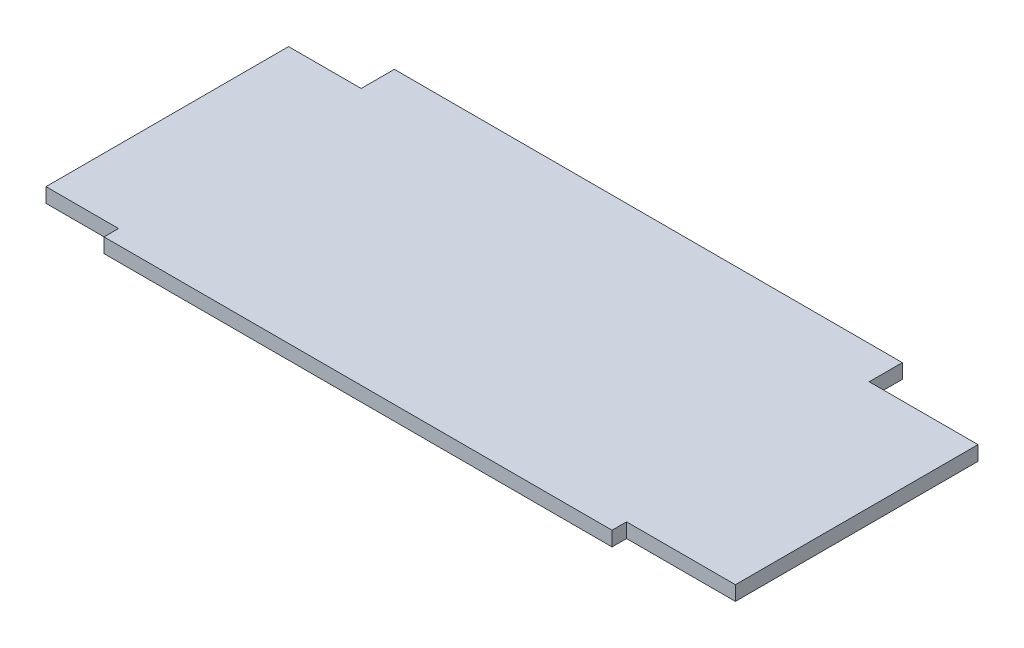
ISO-10303-21;
HEADER;
FILE_DESCRIPTION(('STEP AP214'),'2;1');
FILE_NAME('part.step','',(''),(''),'','','');
FILE_SCHEMA(('AUTOMOTIVE_DESIGN { 1 0 10303 214 1 1 1 1 }'));
ENDSEC;
DATA;
#1=APPLICATION_CONTEXT('core data for automotive mechanical design processes');
#2=APPLICATION_PROTOCOL_DEFINITION('international standard','automotive_design',2000,#1);
#3=PRODUCT_CONTEXT('',#1,'mechanical');
#4=PRODUCT('Part','Part','',(#3));
#5=PRODUCT_RELATED_PRODUCT_CATEGORY('part','',(#4));
#6=PRODUCT_DEFINITION_FORMATION('','',#4);
#7=PRODUCT_DEFINITION_CONTEXT('part definition',#1,'design');
#8=PRODUCT_DEFINITION('design','',#6,#7);
#9=PRODUCT_DEFINITION_SHAPE('','',#8);
#10=(LENGTH_UNIT() NAMED_UNIT(*) SI_UNIT(.MILLI.,.METRE.));
#11=(NAMED_UNIT(*) PLANE_ANGLE_UNIT() SI_UNIT($,.RADIAN.));
#12=(NAMED_UNIT(*) SI_UNIT($,.STERADIAN.) SOLID_ANGLE_UNIT());
#13=UNCERTAINTY_MEASURE_WITH_UNIT(LENGTH_MEASURE(1.E-05),#10,'distance_accuracy_value','');
#14=(GEOMETRIC_REPRESENTATION_CONTEXT(3) GLOBAL_UNCERTAINTY_ASSIGNED_CONTEXT((#13)) GLOBAL_UNIT_ASSIGNED_CONTEXT((#10,
#11,#12)) REPRESENTATION_CONTEXT('',''));
#15=CARTESIAN_POINT('',(0.,0.,0.));
#16=DIRECTION('',(0.,0.,1.));
#17=DIRECTION('',(1.,0.,0.));
#18=AXIS2_PLACEMENT_3D('',#15,#16,#17);
#19=CARTESIAN_POINT('',(78.,-72.5,105.456445940041));
#20=DIRECTION('',(1.,0.,0.));
#21=DIRECTION('',(0.,0.,-1.));
#22=AXIS2_PLACEMENT_3D('',#19,#20,#21);
#23=PLANE('',#22);
#24=DIRECTION('',(0.,-1.,0.));
#25=VECTOR('',#24,1.);
#26=CARTESIAN_POINT('',(78.,-72.5,0.));
#27=LINE('',#26,#25);
#28=CARTESIAN_POINT('',(78.,-72.5,0.));
#29=VERTEX_POINT('',#28);
#30=CARTESIAN_POINT('',(78.,-74.5,0.));
#31=VERTEX_POINT('',#30);
#32=EDGE_CURVE('E146',#29,#31,#27,.T.);
#33=ORIENTED_EDGE('',*,*,#32,.F.);
#34=DIRECTION('',(0.,0.,-1.));
#35=VECTOR('',#34,1.);
#36=CARTESIAN_POINT('',(78.,-72.5,105.456445940041));
#37=LINE('',#36,#35);
#38=CARTESIAN_POINT('',(78.,-72.5,-4.57211966000516));
#39=VERTEX_POINT('',#38);
#40=EDGE_CURVE('E185',#29,#39,#37,.T.);
#41=ORIENTED_EDGE('',*,*,#40,.T.);
#42=DIRECTION('',(0.,1.,0.));
#43=VECTOR('',#42,1.);
#44=CARTESIAN_POINT('',(78.,-72.5,-4.57211966000516));
#45=LINE('',#44,#43);
#46=CARTESIAN_POINT('',(78.,-74.5,-4.57211966000516));
#47=VERTEX_POINT('',#46);
#48=EDGE_CURVE('E194',#47,#39,#45,.T.);
#49=ORIENTED_EDGE('',*,*,#48,.F.);
#50=DIRECTION('',(0.,0.,-1.));
#51=VECTOR('',#50,1.);
#52=CARTESIAN_POINT('',(78.,-74.5,105.456445940041));
#53=LINE('',#52,#51);
#54=EDGE_CURVE('E50',#31,#47,#53,.T.);
#55=ORIENTED_EDGE('',*,*,#54,.F.);
#56=EDGE_LOOP('',(#33,#41,#49,#55));
#57=FACE_BOUND('',#56,.T.);
#58=ADVANCED_FACE('F33',(#57),#23,.F.);
#59=DIRECTION('',(0.,1.,0.));
#60=VECTOR('',#59,1.);
#61=CARTESIAN_POINT('',(78.,-72.5,33.4278803399949));
#62=LINE('',#61,#60);
#63=CARTESIAN_POINT('',(78.,-74.5,33.4278803399949));
#64=VERTEX_POINT('',#63);
#65=CARTESIAN_POINT('',(78.,-72.5,33.4278803399949));
#66=VERTEX_POINT('',#65);
#67=EDGE_CURVE('E58',#64,#66,#62,.T.);
#68=ORIENTED_EDGE('',*,*,#67,.F.);
#69=CARTESIAN_POINT('',(78.,-74.5,35.4278803399948));
#70=VERTEX_POINT('',#69);
#71=EDGE_CURVE('E198',#70,#64,#53,.T.);
#72=ORIENTED_EDGE('',*,*,#71,.F.);
#73=DIRECTION('',(0.,-1.,0.));
#74=VECTOR('',#73,1.);
#75=CARTESIAN_POINT('',(78.,-72.5,35.4278803399948));
#76=LINE('',#75,#74);
#77=CARTESIAN_POINT('',(78.,-72.5,35.4278803399948));
#78=VERTEX_POINT('',#77);
#79=EDGE_CURVE('E218',#78,#70,#76,.T.);
#80=ORIENTED_EDGE('',*,*,#79,.F.);
#81=EDGE_CURVE('E189',#78,#66,#37,.T.);
#82=ORIENTED_EDGE('',*,*,#81,.T.);
#83=EDGE_LOOP('',(#68,#72,#80,#82));
#84=FACE_BOUND('',#83,.T.);
#85=ADVANCED_FACE('F282',(#84),#23,.F.);
#86=CARTESIAN_POINT('',(148.,-72.5,105.456445940041));
#87=DIRECTION('',(-1.,0.,0.));
#88=DIRECTION('',(0.,0.,1.));
#89=AXIS2_PLACEMENT_3D('',#86,#87,#88);
#90=PLANE('',#89);
#91=DIRECTION('',(0.,1.,0.));
#92=VECTOR('',#91,1.);
#93=CARTESIAN_POINT('',(148.,-72.5,0.));
#94=LINE('',#93,#92);
#95=CARTESIAN_POINT('',(148.,-74.5,0.));
#96=VERTEX_POINT('',#95);
#97=CARTESIAN_POINT('',(148.,-72.5,0.));
#98=VERTEX_POINT('',#97);
#99=EDGE_CURVE('E147',#96,#98,#94,.T.);
#100=ORIENTED_EDGE('',*,*,#99,.F.);
#101=DIRECTION('',(0.,0.,-1.));
#102=VECTOR('',#101,1.);
#103=CARTESIAN_POINT('',(148.,-74.5,105.456445940041));
#104=LINE('',#103,#102);
#105=CARTESIAN_POINT('',(148.,-74.5,-4.57211966000516));
#106=VERTEX_POINT('',#105);
#107=EDGE_CURVE('E208',#96,#106,#104,.T.);
#108=ORIENTED_EDGE('',*,*,#107,.T.);
#109=DIRECTION('',(0.,-1.,0.));
#110=VECTOR('',#109,1.);
#111=CARTESIAN_POINT('',(148.,-72.5,-4.57211966000516));
#112=LINE('',#111,#110);
#113=CARTESIAN_POINT('',(148.,-72.5,-4.57211966000516));
#114=VERTEX_POINT('',#113);
#115=EDGE_CURVE('E226',#114,#106,#112,.T.);
#116=ORIENTED_EDGE('',*,*,#115,.F.);
#117=DIRECTION('',(0.,0.,-1.));
#118=VECTOR('',#117,1.);
#119=CARTESIAN_POINT('',(148.,-72.5,105.456445940041));
#120=LINE('',#119,#118);
#121=EDGE_CURVE('E207',#98,#114,#120,.T.);
#122=ORIENTED_EDGE('',*,*,#121,.F.);
#123=EDGE_LOOP('',(#100,#108,#116,#122));
#124=FACE_BOUND('',#123,.T.);
#125=ADVANCED_FACE('F286',(#124),#90,.F.);
#126=DIRECTION('',(0.,-1.,0.));
#127=VECTOR('',#126,1.);
#128=CARTESIAN_POINT('',(148.,-72.5,33.4278803399949));
#129=LINE('',#128,#127);
#130=CARTESIAN_POINT('',(148.,-72.5,33.4278803399949));
#131=VERTEX_POINT('',#130);
#132=CARTESIAN_POINT('',(148.,-74.5,33.4278803399949));
#133=VERTEX_POINT('',#132);
#134=EDGE_CURVE('E150',#131,#133,#129,.T.);
#135=ORIENTED_EDGE('',*,*,#134,.F.);
#136=CARTESIAN_POINT('',(148.,-72.5,35.4278803399948));
#137=VERTEX_POINT('',#136);
#138=EDGE_CURVE('E219',#137,#131,#120,.T.);
#139=ORIENTED_EDGE('',*,*,#138,.F.);
#140=DIRECTION('',(0.,1.,0.));
#141=VECTOR('',#140,1.);
#142=CARTESIAN_POINT('',(148.,-72.5,35.4278803399948));
#143=LINE('',#142,#141);
#144=CARTESIAN_POINT('',(148.,-74.5,35.4278803399948));
#145=VERTEX_POINT('',#144);
#146=EDGE_CURVE('E11',#145,#137,#143,.T.);
#147=ORIENTED_EDGE('',*,*,#146,.F.);
#148=EDGE_CURVE('E204',#145,#133,#104,.T.);
#149=ORIENTED_EDGE('',*,*,#148,.T.);
#150=EDGE_LOOP('',(#135,#139,#147,#149));
#151=FACE_BOUND('',#150,.T.);
#152=ADVANCED_FACE('F290',(#151),#90,.F.);
#153=CARTESIAN_POINT('',(78.,-74.5,105.456445940041));
#154=DIRECTION('',(0.,1.,0.));
#155=DIRECTION('',(0.,0.,1.));
#156=AXIS2_PLACEMENT_3D('',#153,#154,#155);
#157=PLANE('',#156);
#158=DIRECTION('',(1.,0.,0.));
#159=VECTOR('',#158,1.);
#160=CARTESIAN_POINT('',(78.,-74.5,35.4278803399948));
#161=LINE('',#160,#159);
#162=EDGE_CURVE('E42',#70,#145,#161,.T.);
#163=ORIENTED_EDGE('',*,*,#162,.F.);
#164=ORIENTED_EDGE('',*,*,#71,.T.);
#165=DIRECTION('',(1.,0.,0.));
#166=VECTOR('',#165,1.);
#167=CARTESIAN_POINT('',(68.,-74.5,33.4278803399949));
#168=LINE('',#167,#166);
#169=CARTESIAN_POINT('',(68.,-74.5,33.4278803399949));
#170=VERTEX_POINT('',#169);
#171=EDGE_CURVE('E131',#170,#64,#168,.T.);
#172=ORIENTED_EDGE('',*,*,#171,.F.);
#173=DIRECTION('',(0.,0.,1.));
#174=VECTOR('',#173,1.);
#175=CARTESIAN_POINT('',(68.,-74.5,0.));
#176=LINE('',#175,#174);
#177=CARTESIAN_POINT('',(68.,-74.5,0.));
#178=VERTEX_POINT('',#177);
#179=EDGE_CURVE('E124',#178,#170,#176,.T.);
#180=ORIENTED_EDGE('',*,*,#179,.F.);
#181=DIRECTION('',(1.,0.,0.));
#182=VECTOR('',#181,1.);
#183=CARTESIAN_POINT('',(68.,-74.5,0.));
#184=LINE('',#183,#182);
#185=EDGE_CURVE('E128',#178,#31,#184,.T.);
#186=ORIENTED_EDGE('',*,*,#185,.T.);
#187=ORIENTED_EDGE('',*,*,#54,.T.);
#188=DIRECTION('',(-1.,0.,0.));
#189=VECTOR('',#188,1.);
#190=CARTESIAN_POINT('',(78.,-74.5,-4.57211966000516));
#191=LINE('',#190,#189);
#192=EDGE_CURVE('E190',#106,#47,#191,.T.);
#193=ORIENTED_EDGE('',*,*,#192,.F.);
#194=ORIENTED_EDGE('',*,*,#107,.F.);
#195=DIRECTION('',(-1.,0.,0.));
#196=VECTOR('',#195,1.);
#197=CARTESIAN_POINT('',(163.,-74.5,0.));
#198=LINE('',#197,#196);
#199=CARTESIAN_POINT('',(163.,-74.5,0.));
#200=VERTEX_POINT('',#199);
#201=EDGE_CURVE('E242',#200,#96,#198,.T.);
#202=ORIENTED_EDGE('',*,*,#201,.F.);
#203=DIRECTION('',(0.,0.,-1.));
#204=VECTOR('',#203,1.);
#205=CARTESIAN_POINT('',(163.,-74.5,0.));
#206=LINE('',#205,#204);
#207=CARTESIAN_POINT('',(163.,-74.5,33.4278803399949));
#208=VERTEX_POINT('',#207);
#209=EDGE_CURVE('E254',#208,#200,#206,.T.);
#210=ORIENTED_EDGE('',*,*,#209,.F.);
#211=DIRECTION('',(-1.,0.,0.));
#212=VECTOR('',#211,1.);
#213=CARTESIAN_POINT('',(163.,-74.5,33.4278803399949));
#214=LINE('',#213,#212);
#215=EDGE_CURVE('E238',#208,#133,#214,.T.);
#216=ORIENTED_EDGE('',*,*,#215,.T.);
#217=ORIENTED_EDGE('',*,*,#148,.F.);
#218=EDGE_LOOP('',(#163,#164,#172,#180,#186,#187,#193,#194,#202,#210,#216,#217));
#219=FACE_BOUND('',#218,.T.);
#220=ADVANCED_FACE('F126',(#219),#157,.F.);
#221=CARTESIAN_POINT('',(78.,-72.5,105.456445940041));
#222=DIRECTION('',(0.,-1.,0.));
#223=DIRECTION('',(1.,0.,0.));
#224=AXIS2_PLACEMENT_3D('',#221,#222,#223);
#225=PLANE('',#224);
#226=DIRECTION('',(-1.,0.,0.));
#227=VECTOR('',#226,1.);
#228=CARTESIAN_POINT('',(78.,-72.5,35.4278803399948));
#229=LINE('',#228,#227);
#230=EDGE_CURVE('E214',#137,#78,#229,.T.);
#231=ORIENTED_EDGE('',*,*,#230,.F.);
#232=ORIENTED_EDGE('',*,*,#138,.T.);
#233=DIRECTION('',(-1.,0.,0.));
#234=VECTOR('',#233,1.);
#235=CARTESIAN_POINT('',(163.,-72.5,33.4278803399949));
#236=LINE('',#235,#234);
#237=CARTESIAN_POINT('',(163.,-72.5,33.4278803399949));
#238=VERTEX_POINT('',#237);
#239=EDGE_CURVE('E241',#238,#131,#236,.T.);
#240=ORIENTED_EDGE('',*,*,#239,.F.);
#241=DIRECTION('',(0.,0.,1.));
#242=VECTOR('',#241,1.);
#243=CARTESIAN_POINT('',(163.,-72.5,0.));
#244=LINE('',#243,#242);
#245=CARTESIAN_POINT('',(163.,-72.5,0.));
#246=VERTEX_POINT('',#245);
#247=EDGE_CURVE('E263',#246,#238,#244,.T.);
#248=ORIENTED_EDGE('',*,*,#247,.F.);
#249=DIRECTION('',(-1.,0.,0.));
#250=VECTOR('',#249,1.);
#251=CARTESIAN_POINT('',(163.,-72.5,0.));
#252=LINE('',#251,#250);
#253=EDGE_CURVE('E229',#246,#98,#252,.T.);
#254=ORIENTED_EDGE('',*,*,#253,.T.);
#255=ORIENTED_EDGE('',*,*,#121,.T.);
#256=DIRECTION('',(1.,0.,0.));
#257=VECTOR('',#256,1.);
#258=CARTESIAN_POINT('',(78.,-72.5,-4.57211966000516));
#259=LINE('',#258,#257);
#260=EDGE_CURVE('E187',#39,#114,#259,.T.);
#261=ORIENTED_EDGE('',*,*,#260,.F.);
#262=ORIENTED_EDGE('',*,*,#40,.F.);
#263=DIRECTION('',(1.,0.,0.));
#264=VECTOR('',#263,1.);
#265=CARTESIAN_POINT('',(68.,-72.5,0.));
#266=LINE('',#265,#264);
#267=CARTESIAN_POINT('',(68.,-72.5,0.));
#268=VERTEX_POINT('',#267);
#269=EDGE_CURVE('E160',#268,#29,#266,.T.);
#270=ORIENTED_EDGE('',*,*,#269,.F.);
#271=DIRECTION('',(0.,0.,-1.));
#272=VECTOR('',#271,1.);
#273=CARTESIAN_POINT('',(68.,-72.5,0.));
#274=LINE('',#273,#272);
#275=CARTESIAN_POINT('',(68.,-72.5,33.4278803399949));
#276=VERTEX_POINT('',#275);
#277=EDGE_CURVE('E140',#276,#268,#274,.T.);
#278=ORIENTED_EDGE('',*,*,#277,.F.);
#279=DIRECTION('',(1.,0.,0.));
#280=VECTOR('',#279,1.);
#281=CARTESIAN_POINT('',(68.,-72.5,33.4278803399949));
#282=LINE('',#281,#280);
#283=EDGE_CURVE('E152',#276,#66,#282,.T.);
#284=ORIENTED_EDGE('',*,*,#283,.T.);
#285=ORIENTED_EDGE('',*,*,#81,.F.);
#286=EDGE_LOOP('',(#231,#232,#240,#248,#254,#255,#261,#262,#270,#278,#284,#285));
#287=FACE_BOUND('',#286,.T.);
#288=ADVANCED_FACE('F182',(#287),#225,.F.);
#289=CARTESIAN_POINT('',(143.999999999999,3.84978507406153E-12,35.4278803399948));
#290=DIRECTION('',(0.,0.,1.));
#291=DIRECTION('',(-1.,0.,0.));
#292=AXIS2_PLACEMENT_3D('',#289,#290,#291);
#293=PLANE('',#292);
#294=ORIENTED_EDGE('',*,*,#230,.T.);
#295=ORIENTED_EDGE('',*,*,#79,.T.);
#296=ORIENTED_EDGE('',*,*,#162,.T.);
#297=ORIENTED_EDGE('',*,*,#146,.T.);
#298=EDGE_LOOP('',(#294,#295,#296,#297));
#299=FACE_BOUND('',#298,.T.);
#300=ADVANCED_FACE('F35',(#299),#293,.T.);
#301=CARTESIAN_POINT('',(-1.0547118733939E-12,3.85802501057242E-12,-4.57211966000516));
#302=DIRECTION('',(0.,0.,1.));
#303=DIRECTION('',(0.,-1.,0.));
#304=AXIS2_PLACEMENT_3D('',#301,#302,#303);
#305=PLANE('',#304);
#306=ORIENTED_EDGE('',*,*,#48,.T.);
#307=ORIENTED_EDGE('',*,*,#260,.T.);
#308=ORIENTED_EDGE('',*,*,#115,.T.);
#309=ORIENTED_EDGE('',*,*,#192,.T.);
#310=EDGE_LOOP('',(#306,#307,#308,#309));
#311=FACE_BOUND('',#310,.T.);
#312=ADVANCED_FACE('F280',(#311),#305,.F.);
#313=CARTESIAN_POINT('',(163.,-72.5,0.));
#314=DIRECTION('',(0.,0.,1.));
#315=DIRECTION('',(0.,-1.,0.));
#316=AXIS2_PLACEMENT_3D('',#313,#314,#315);
#317=PLANE('',#316);
#318=ORIENTED_EDGE('',*,*,#99,.T.);
#319=ORIENTED_EDGE('',*,*,#253,.F.);
#320=DIRECTION('',(0.,1.,0.));
#321=VECTOR('',#320,1.);
#322=CARTESIAN_POINT('',(163.,-72.5,0.));
#323=LINE('',#322,#321);
#324=EDGE_CURVE('E167',#200,#246,#323,.T.);
#325=ORIENTED_EDGE('',*,*,#324,.F.);
#326=ORIENTED_EDGE('',*,*,#201,.T.);
#327=EDGE_LOOP('',(#318,#319,#325,#326));
#328=FACE_BOUND('',#327,.T.);
#329=ADVANCED_FACE('F268',(#328),#317,.F.);
#330=CARTESIAN_POINT('',(163.,-72.5,33.4278803399949));
#331=DIRECTION('',(0.,0.,-1.));
#332=DIRECTION('',(-1.,0.,0.));
#333=AXIS2_PLACEMENT_3D('',#330,#331,#332);
#334=PLANE('',#333);
#335=ORIENTED_EDGE('',*,*,#134,.T.);
#336=ORIENTED_EDGE('',*,*,#215,.F.);
#337=DIRECTION('',(0.,-1.,0.));
#338=VECTOR('',#337,1.);
#339=CARTESIAN_POINT('',(163.,-72.5,33.4278803399949));
#340=LINE('',#339,#338);
#341=EDGE_CURVE('E259',#238,#208,#340,.T.);
#342=ORIENTED_EDGE('',*,*,#341,.F.);
#343=ORIENTED_EDGE('',*,*,#239,.T.);
#344=EDGE_LOOP('',(#335,#336,#342,#343));
#345=FACE_BOUND('',#344,.T.);
#346=ADVANCED_FACE('F273',(#345),#334,.F.);
#347=CARTESIAN_POINT('',(163.,0.,0.));
#348=DIRECTION('',(-1.,0.,0.));
#349=DIRECTION('',(0.,0.,1.));
#350=AXIS2_PLACEMENT_3D('',#347,#348,#349);
#351=PLANE('',#350);
#352=ORIENTED_EDGE('',*,*,#324,.T.);
#353=ORIENTED_EDGE('',*,*,#247,.T.);
#354=ORIENTED_EDGE('',*,*,#341,.T.);
#355=ORIENTED_EDGE('',*,*,#209,.T.);
#356=EDGE_LOOP('',(#352,#353,#354,#355));
#357=FACE_BOUND('',#356,.T.);
#358=ADVANCED_FACE('F267',(#357),#351,.F.);
#359=CARTESIAN_POINT('',(68.,-72.5,0.));
#360=DIRECTION('',(0.,0.,1.));
#361=DIRECTION('',(0.,-1.,0.));
#362=AXIS2_PLACEMENT_3D('',#359,#360,#361);
#363=PLANE('',#362);
#364=ORIENTED_EDGE('',*,*,#32,.T.);
#365=ORIENTED_EDGE('',*,*,#185,.F.);
#366=DIRECTION('',(0.,-1.,0.));
#367=VECTOR('',#366,1.);
#368=CARTESIAN_POINT('',(68.,-72.5,0.));
#369=LINE('',#368,#367);
#370=EDGE_CURVE('E135',#268,#178,#369,.T.);
#371=ORIENTED_EDGE('',*,*,#370,.F.);
#372=ORIENTED_EDGE('',*,*,#269,.T.);
#373=EDGE_LOOP('',(#364,#365,#371,#372));
#374=FACE_BOUND('',#373,.T.);
#375=ADVANCED_FACE('F145',(#374),#363,.F.);
#376=CARTESIAN_POINT('',(68.,-72.5,33.4278803399949));
#377=DIRECTION('',(0.,0.,-1.));
#378=DIRECTION('',(-1.,0.,0.));
#379=AXIS2_PLACEMENT_3D('',#376,#377,#378);
#380=PLANE('',#379);
#381=ORIENTED_EDGE('',*,*,#67,.T.);
#382=ORIENTED_EDGE('',*,*,#283,.F.);
#383=DIRECTION('',(0.,1.,0.));
#384=VECTOR('',#383,1.);
#385=CARTESIAN_POINT('',(68.,-72.5,33.4278803399949));
#386=LINE('',#385,#384);
#387=EDGE_CURVE('E134',#170,#276,#386,.T.);
#388=ORIENTED_EDGE('',*,*,#387,.F.);
#389=ORIENTED_EDGE('',*,*,#171,.T.);
#390=EDGE_LOOP('',(#381,#382,#388,#389));
#391=FACE_BOUND('',#390,.T.);
#392=ADVANCED_FACE('F180',(#391),#380,.F.);
#393=CARTESIAN_POINT('',(68.,0.,0.));
#394=DIRECTION('',(-1.,0.,0.));
#395=DIRECTION('',(0.,0.,1.));
#396=AXIS2_PLACEMENT_3D('',#393,#394,#395);
#397=PLANE('',#396);
#398=ORIENTED_EDGE('',*,*,#370,.T.);
#399=ORIENTED_EDGE('',*,*,#179,.T.);
#400=ORIENTED_EDGE('',*,*,#387,.T.);
#401=ORIENTED_EDGE('',*,*,#277,.T.);
#402=EDGE_LOOP('',(#398,#399,#400,#401));
#403=FACE_BOUND('',#402,.T.);
#404=ADVANCED_FACE('F138',(#403),#397,.T.);
#405=CLOSED_SHELL('',(#58,#85,#125,#152,#220,#288,#300,#312,#329,#346,#358,#375,#392,#404));
#406=MANIFOLD_SOLID_BREP('B2',#405);
#407=ADVANCED_BREP_SHAPE_REPRESENTATION('',(#18,#406),#14);
#408=SHAPE_DEFINITION_REPRESENTATION(#9,#407);
ENDSEC;
END-ISO-10303-21;
